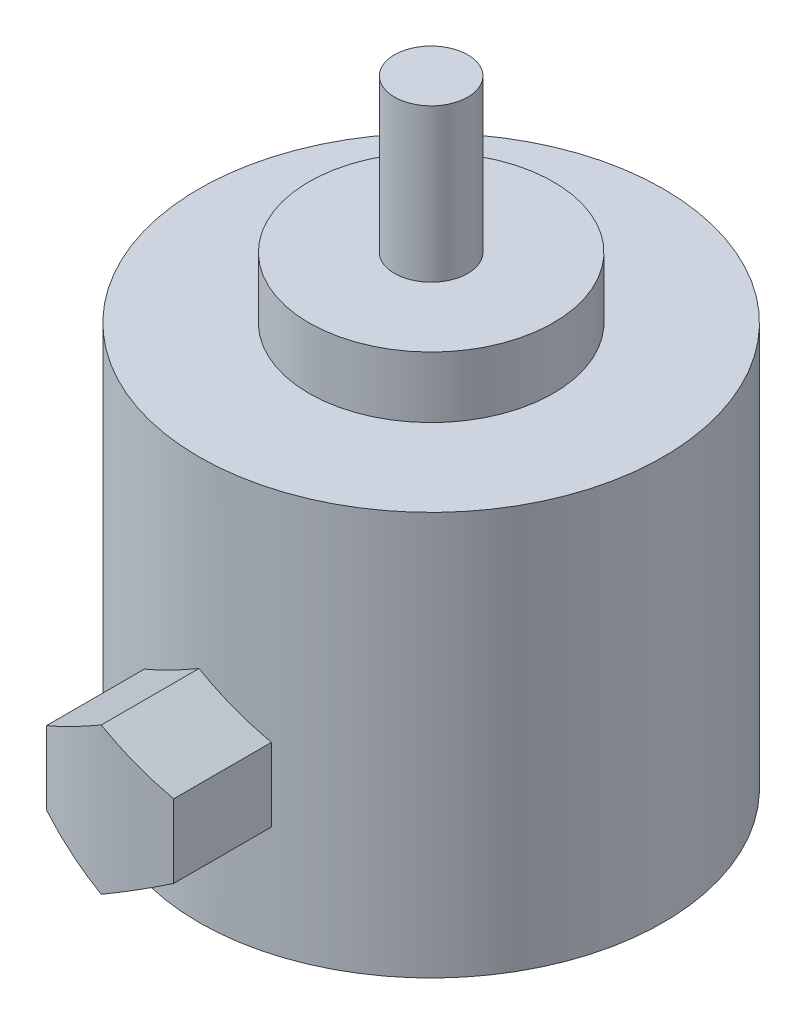
ISO-10303-21;
HEADER;
FILE_DESCRIPTION(('STEP AP214'),'2;1');
FILE_NAME('part.step','',(''),(''),'','','');
FILE_SCHEMA(('AUTOMOTIVE_DESIGN { 1 0 10303 214 1 1 1 1 }'));
ENDSEC;
DATA;
#1=APPLICATION_CONTEXT('core data for automotive mechanical design processes');
#2=APPLICATION_PROTOCOL_DEFINITION('international standard','automotive_design',2000,#1);
#3=PRODUCT_CONTEXT('',#1,'mechanical');
#4=PRODUCT('Part','Part','',(#3));
#5=PRODUCT_RELATED_PRODUCT_CATEGORY('part','',(#4));
#6=PRODUCT_DEFINITION_FORMATION('','',#4);
#7=PRODUCT_DEFINITION_CONTEXT('part definition',#1,'design');
#8=PRODUCT_DEFINITION('design','',#6,#7);
#9=PRODUCT_DEFINITION_SHAPE('','',#8);
#10=(LENGTH_UNIT() NAMED_UNIT(*) SI_UNIT(.MILLI.,.METRE.));
#11=(NAMED_UNIT(*) PLANE_ANGLE_UNIT() SI_UNIT($,.RADIAN.));
#12=(NAMED_UNIT(*) SI_UNIT($,.STERADIAN.) SOLID_ANGLE_UNIT());
#13=UNCERTAINTY_MEASURE_WITH_UNIT(LENGTH_MEASURE(1.E-05),#10,'distance_accuracy_value','');
#14=(GEOMETRIC_REPRESENTATION_CONTEXT(3) GLOBAL_UNCERTAINTY_ASSIGNED_CONTEXT((#13)) GLOBAL_UNIT_ASSIGNED_CONTEXT((#10,
#11,#12)) REPRESENTATION_CONTEXT('',''));
#15=CARTESIAN_POINT('',(0.,0.,0.));
#16=DIRECTION('',(0.,0.,1.));
#17=DIRECTION('',(1.,0.,0.));
#18=AXIS2_PLACEMENT_3D('',#15,#16,#17);
#19=CARTESIAN_POINT('',(0.,33.,0.));
#20=DIRECTION('',(0.,-1.,0.));
#21=DIRECTION('',(0.,0.,-1.));
#22=AXIS2_PLACEMENT_3D('',#19,#20,#21);
#23=CYLINDRICAL_SURFACE('',#22,19.);
#24=CARTESIAN_POINT('',(0.,18.,19.));
#25=CARTESIAN_POINT('',(-1.31767025414648,17.2392427240654,19.));
#26=CARTESIAN_POINT('',(-2.62319740322337,16.4854962731115,18.8180454719326));
#27=CARTESIAN_POINT('',(-3.92825582087346,15.732020444373,18.6361562721164));
#28=CARTESIAN_POINT('',(-5.19615242270662,15.,18.2756668824971));
#29=B_SPLINE_CURVE_WITH_KNOTS('',2,(#24,#25,#26,#27,#28),.UNSPECIFIED.,.F.,.F.,(3,2,3),(0.,0.5,
1.),.UNSPECIFIED.);
#30=CARTESIAN_POINT('',(0.,18.,19.));
#31=VERTEX_POINT('',#30);
#32=CARTESIAN_POINT('',(-5.19615242270663,15.,18.2756668824971));
#33=VERTEX_POINT('',#32);
#34=EDGE_CURVE('E60',#31,#33,#29,.T.);
#35=ORIENTED_EDGE('',*,*,#34,.F.);
#36=CARTESIAN_POINT('',(5.19615242270663,15.,18.2756668824971));
#37=CARTESIAN_POINT('',(3.92871544246554,15.7317550817231,18.6360255921327));
#38=CARTESIAN_POINT('',(2.62319740322338,16.4854962731115,18.8180454719326));
#39=CARTESIAN_POINT('',(1.31814809226343,17.2389668440999,19.));
#40=CARTESIAN_POINT('',(0.,18.,19.));
#41=B_SPLINE_CURVE_WITH_KNOTS('',2,(#36,#37,#38,#39,#40),.UNSPECIFIED.,.F.,.F.,(3,2,3),(0.,0.5,
1.),.UNSPECIFIED.);
#42=CARTESIAN_POINT('',(5.19615242270664,15.,18.2756668824971));
#43=VERTEX_POINT('',#42);
#44=EDGE_CURVE('E244',#43,#31,#41,.T.);
#45=ORIENTED_EDGE('',*,*,#44,.F.);
#46=DIRECTION('',(0.,-1.,0.));
#47=VECTOR('',#46,1.);
#48=CARTESIAN_POINT('',(5.19615242270664,33.,18.2756668824971));
#49=LINE('',#48,#47);
#50=CARTESIAN_POINT('',(5.19615242270664,9.,18.2756668824971));
#51=VERTEX_POINT('',#50);
#52=EDGE_CURVE('E131',#43,#51,#49,.T.);
#53=ORIENTED_EDGE('',*,*,#52,.T.);
#54=CARTESIAN_POINT('',(0.,6.,19.));
#55=CARTESIAN_POINT('',(1.31767025414855,6.76075727593583,19.));
#56=CARTESIAN_POINT('',(2.62319740322338,7.51450372688854,18.8180454719326));
#57=CARTESIAN_POINT('',(3.9282558208755,8.26797955562818,18.6361562721158));
#58=CARTESIAN_POINT('',(5.19615242270664,9.,18.2756668824971));
#59=B_SPLINE_CURVE_WITH_KNOTS('',2,(#54,#55,#56,#57,#58),.UNSPECIFIED.,.F.,.F.,(3,2,3),(0.,0.5,
1.),.UNSPECIFIED.);
#60=CARTESIAN_POINT('',(0.,6.,19.));
#61=VERTEX_POINT('',#60);
#62=EDGE_CURVE('E112',#61,#51,#59,.T.);
#63=ORIENTED_EDGE('',*,*,#62,.F.);
#64=CARTESIAN_POINT('',(-5.19615242270663,9.,18.2756668824971));
#65=CARTESIAN_POINT('',(-3.92871544239619,8.26824491823688,18.6360255921524));
#66=CARTESIAN_POINT('',(-2.62319740322338,7.51450372688854,18.8180454719326));
#67=CARTESIAN_POINT('',(-1.31814809219136,6.76103315585847,19.));
#68=CARTESIAN_POINT('',(0.,6.,19.));
#69=B_SPLINE_CURVE_WITH_KNOTS('',2,(#64,#65,#66,#67,#68),.UNSPECIFIED.,.F.,.F.,(3,2,3),(0.,0.5,
1.),.UNSPECIFIED.);
#70=CARTESIAN_POINT('',(-5.19615242270663,9.,18.2756668824971));
#71=VERTEX_POINT('',#70);
#72=EDGE_CURVE('E173',#71,#61,#69,.T.);
#73=ORIENTED_EDGE('',*,*,#72,.F.);
#74=DIRECTION('',(0.,-1.,0.));
#75=VECTOR('',#74,1.);
#76=CARTESIAN_POINT('',(-5.19615242270663,33.,18.2756668824971));
#77=LINE('',#76,#75);
#78=EDGE_CURVE('E66',#33,#71,#77,.T.);
#79=ORIENTED_EDGE('',*,*,#78,.F.);
#80=EDGE_LOOP('',(#35,#45,#53,#63,#73,#79));
#81=FACE_BOUND('',#80,.T.);
#82=CARTESIAN_POINT('',(0.,33.,0.));
#83=DIRECTION('',(0.,1.,0.));
#84=DIRECTION('',(0.,0.,1.));
#85=AXIS2_PLACEMENT_3D('',#82,#83,#84);
#86=CIRCLE('',#85,19.);
#87=CARTESIAN_POINT('',(0.,33.,19.));
#88=VERTEX_POINT('',#87);
#89=EDGE_CURVE('E281',#88,#88,#86,.T.);
#90=ORIENTED_EDGE('',*,*,#89,.F.);
#91=EDGE_LOOP('',(#90));
#92=FACE_BOUND('',#91,.T.);
#93=CARTESIAN_POINT('',(0.,0.,0.));
#94=DIRECTION('',(0.,1.,0.));
#95=DIRECTION('',(0.,0.,1.));
#96=AXIS2_PLACEMENT_3D('',#93,#94,#95);
#97=CIRCLE('',#96,19.);
#98=CARTESIAN_POINT('',(0.,0.,19.));
#99=VERTEX_POINT('',#98);
#100=EDGE_CURVE('E277',#99,#99,#97,.T.);
#101=ORIENTED_EDGE('',*,*,#100,.T.);
#102=EDGE_LOOP('',(#101));
#103=FACE_BOUND('',#102,.T.);
#104=ADVANCED_FACE('F41',(#81,#92,#103),#23,.T.);
#105=CARTESIAN_POINT('',(0.,33.,0.));
#106=DIRECTION('',(0.,1.,0.));
#107=DIRECTION('',(0.,0.,1.));
#108=AXIS2_PLACEMENT_3D('',#105,#106,#107);
#109=PLANE('',#108);
#110=CARTESIAN_POINT('',(0.,33.,0.));
#111=DIRECTION('',(0.,1.,0.));
#112=DIRECTION('',(0.,0.,1.));
#113=AXIS2_PLACEMENT_3D('',#110,#111,#112);
#114=CIRCLE('',#113,10.);
#115=CARTESIAN_POINT('',(0.,33.,10.));
#116=VERTEX_POINT('',#115);
#117=EDGE_CURVE('E52',#116,#116,#114,.T.);
#118=ORIENTED_EDGE('',*,*,#117,.F.);
#119=EDGE_LOOP('',(#118));
#120=FACE_BOUND('',#119,.T.);
#121=ORIENTED_EDGE('',*,*,#89,.T.);
#122=EDGE_LOOP('',(#121));
#123=FACE_BOUND('',#122,.T.);
#124=ADVANCED_FACE('F321',(#120,#123),#109,.T.);
#125=CARTESIAN_POINT('',(0.,0.,0.));
#126=DIRECTION('',(0.,1.,0.));
#127=DIRECTION('',(0.,0.,1.));
#128=AXIS2_PLACEMENT_3D('',#125,#126,#127);
#129=PLANE('',#128);
#130=ORIENTED_EDGE('',*,*,#100,.F.);
#131=EDGE_LOOP('',(#130));
#132=FACE_BOUND('',#131,.T.);
#133=ADVANCED_FACE('F325',(#132),#129,.F.);
#134=CARTESIAN_POINT('',(0.,38.,0.));
#135=DIRECTION('',(0.,-1.,0.));
#136=DIRECTION('',(0.,0.,-1.));
#137=AXIS2_PLACEMENT_3D('',#134,#135,#136);
#138=CYLINDRICAL_SURFACE('',#137,10.);
#139=CARTESIAN_POINT('',(0.,38.,0.));
#140=DIRECTION('',(0.,1.,0.));
#141=DIRECTION('',(0.,0.,1.));
#142=AXIS2_PLACEMENT_3D('',#139,#140,#141);
#143=CIRCLE('',#142,10.);
#144=CARTESIAN_POINT('',(0.,38.,10.));
#145=VERTEX_POINT('',#144);
#146=EDGE_CURVE('E272',#145,#145,#143,.T.);
#147=ORIENTED_EDGE('',*,*,#146,.F.);
#148=EDGE_LOOP('',(#147));
#149=FACE_BOUND('',#148,.T.);
#150=ORIENTED_EDGE('',*,*,#117,.T.);
#151=EDGE_LOOP('',(#150));
#152=FACE_BOUND('',#151,.T.);
#153=ADVANCED_FACE('F331',(#149,#152),#138,.T.);
#154=CARTESIAN_POINT('',(0.,38.,0.));
#155=DIRECTION('',(0.,1.,0.));
#156=DIRECTION('',(0.,0.,1.));
#157=AXIS2_PLACEMENT_3D('',#154,#155,#156);
#158=PLANE('',#157);
#159=CARTESIAN_POINT('',(0.,38.,0.));
#160=DIRECTION('',(0.,1.,0.));
#161=DIRECTION('',(0.,0.,1.));
#162=AXIS2_PLACEMENT_3D('',#159,#160,#161);
#163=CIRCLE('',#162,3.);
#164=CARTESIAN_POINT('',(0.,38.,3.));
#165=VERTEX_POINT('',#164);
#166=EDGE_CURVE('E11',#165,#165,#163,.T.);
#167=ORIENTED_EDGE('',*,*,#166,.F.);
#168=EDGE_LOOP('',(#167));
#169=FACE_BOUND('',#168,.T.);
#170=ORIENTED_EDGE('',*,*,#146,.T.);
#171=EDGE_LOOP('',(#170));
#172=FACE_BOUND('',#171,.T.);
#173=ADVANCED_FACE('F338',(#169,#172),#158,.T.);
#174=CARTESIAN_POINT('',(0.,50.5,0.));
#175=DIRECTION('',(0.,-1.,0.));
#176=DIRECTION('',(0.,0.,-1.));
#177=AXIS2_PLACEMENT_3D('',#174,#175,#176);
#178=CYLINDRICAL_SURFACE('',#177,3.);
#179=CARTESIAN_POINT('',(0.,50.5,0.));
#180=DIRECTION('',(0.,1.,0.));
#181=DIRECTION('',(0.,0.,1.));
#182=AXIS2_PLACEMENT_3D('',#179,#180,#181);
#183=CIRCLE('',#182,3.);
#184=CARTESIAN_POINT('',(0.,50.5,3.));
#185=VERTEX_POINT('',#184);
#186=EDGE_CURVE('E134',#185,#185,#183,.T.);
#187=ORIENTED_EDGE('',*,*,#186,.F.);
#188=EDGE_LOOP('',(#187));
#189=FACE_BOUND('',#188,.T.);
#190=ORIENTED_EDGE('',*,*,#166,.T.);
#191=EDGE_LOOP('',(#190));
#192=FACE_BOUND('',#191,.T.);
#193=ADVANCED_FACE('F341',(#189,#192),#178,.T.);
#194=CARTESIAN_POINT('',(0.,50.5,0.));
#195=DIRECTION('',(0.,1.,0.));
#196=DIRECTION('',(0.,0.,1.));
#197=AXIS2_PLACEMENT_3D('',#194,#195,#196);
#198=PLANE('',#197);
#199=ORIENTED_EDGE('',*,*,#186,.T.);
#200=EDGE_LOOP('',(#199));
#201=FACE_BOUND('',#200,.T.);
#202=ADVANCED_FACE('F188',(#201),#198,.T.);
#203=CARTESIAN_POINT('',(0.,33.,8.));
#204=DIRECTION('',(0.,-1.,0.));
#205=DIRECTION('',(0.,0.,-1.));
#206=AXIS2_PLACEMENT_3D('',#203,#204,#205);
#207=CYLINDRICAL_SURFACE('',#206,19.);
#208=DIRECTION('',(0.,-1.,0.));
#209=VECTOR('',#208,1.);
#210=CARTESIAN_POINT('',(5.19615242270664,33.,26.2756668824971));
#211=LINE('',#210,#209);
#212=CARTESIAN_POINT('',(5.19615242270664,15.,26.2756668824971));
#213=VERTEX_POINT('',#212);
#214=CARTESIAN_POINT('',(5.19615242270664,9.,26.2756668824971));
#215=VERTEX_POINT('',#214);
#216=EDGE_CURVE('E102',#213,#215,#211,.T.);
#217=ORIENTED_EDGE('',*,*,#216,.F.);
#218=CARTESIAN_POINT('',(5.19615242270663,15.,26.2756668824971));
#219=CARTESIAN_POINT('',(5.12862885958459,15.0389848333847,26.2948652347727));
#220=CARTESIAN_POINT('',(5.06102418601699,15.0780169786119,26.3136821792977));
#221=CARTESIAN_POINT('',(4.92451436171275,15.1568323670652,26.3508650198714));
#222=CARTESIAN_POINT('',(4.85560655459361,15.1966171483103,26.3692179044273));
#223=CARTESIAN_POINT('',(4.71648923030958,15.2769377808235,26.4054334697229));
#224=CARTESIAN_POINT('',(4.64627712622208,15.3174751175582,26.4232829187712));
#225=CARTESIAN_POINT('',(4.50455072024066,15.3993009279824,26.4584517357777));
#226=CARTESIAN_POINT('',(4.43303390960321,15.440590838753,26.4757576508858));
#227=CARTESIAN_POINT('',(4.2886983746289,15.5239218595645,26.5097988187005));
#228=CARTESIAN_POINT('',(4.21587722832226,15.5659643605964,26.5265203967851));
#229=CARTESIAN_POINT('',(4.06893397264344,15.6508005285419,26.5593516404835));
#230=CARTESIAN_POINT('',(3.99480953446151,15.6935955410608,26.5754474096853));
#231=CARTESIAN_POINT('',(3.85292957816229,15.7755101610619,26.6053680074095));
#232=CARTESIAN_POINT('',(3.78518590431214,15.8146227875206,26.6192681763678));
#233=CARTESIAN_POINT('',(3.6479678485054,15.8938476417666,26.6466442371496));
#234=CARTESIAN_POINT('',(3.57849076736368,15.9339614364654,26.6601020713283));
#235=CARTESIAN_POINT('',(3.43780418437584,16.015188583035,26.6865391146336));
#236=CARTESIAN_POINT('',(3.36659207058253,16.0563034269615,26.69949983995));
#237=CARTESIAN_POINT('',(3.22243472485641,16.1395327843132,26.724886976792));
#238=CARTESIAN_POINT('',(3.14948698530837,16.1816487236673,26.7372944769544));
#239=CARTESIAN_POINT('',(3.00185873566901,16.2668802866835,26.7615181514312));
#240=CARTESIAN_POINT('',(2.92717583853859,16.309997272435,26.7733149859524));
#241=CARTESIAN_POINT('',(2.77607880188176,16.3972311499375,26.7962589964823));
#242=CARTESIAN_POINT('',(2.69966241368164,16.4413493486592,26.8073864035236));
#243=CARTESIAN_POINT('',(2.55297623669258,16.5260383264664,26.8278341610771));
#244=CARTESIAN_POINT('',(2.48271406432301,16.5666046058182,26.8372278743572));
#245=CARTESIAN_POINT('',(2.33978377258606,16.6491258445978,26.8555236851809));
#246=CARTESIAN_POINT('',(2.26711309127337,16.6910822696708,26.8643991713521));
#247=CARTESIAN_POINT('',(2.11936561870511,16.7763839773837,26.8815782307488));
#248=CARTESIAN_POINT('',(2.04428642541902,16.8197306368836,26.8898543236878));
#249=CARTESIAN_POINT('',(1.89962886288369,16.9032488064091,26.9049279030037));
#250=CARTESIAN_POINT('',(1.83005547546755,16.943417386177,26.9117895271912));
#251=CARTESIAN_POINT('',(1.68759481779846,17.0256675015648,26.9250463227175));
#252=CARTESIAN_POINT('',(1.61470496342336,17.0677505135577,26.931404592783));
#253=CARTESIAN_POINT('',(1.46561099154766,17.1538295083017,26.9435431211012));
#254=CARTESIAN_POINT('',(1.38940450459008,17.1978268357253,26.9492847885961));
#255=CARTESIAN_POINT('',(1.24567324617153,17.2808103041393,26.9592425080131));
#256=CARTESIAN_POINT('',(1.17815356627787,17.3197933742711,26.9635579697093));
#257=CARTESIAN_POINT('',(1.03765931722977,17.4009085137794,26.971784427261));
#258=CARTESIAN_POINT('',(0.964682080515094,17.4430420889141,26.9756351206566));
#259=CARTESIAN_POINT('',(0.813271763412981,17.5304578744894,26.9827487966753));
#260=CARTESIAN_POINT('',(0.734836340694596,17.5757413400158,26.9859468209424));
#261=CARTESIAN_POINT('',(0.599687652437891,17.653770679029,26.9906185721026));
#262=CARTESIAN_POINT('',(0.542979904212539,17.6865124369259,26.9923245387024));
#263=CARTESIAN_POINT('',(0.413342357208231,17.7613606135231,26.9956434336557));
#264=CARTESIAN_POINT('',(0.340409128019849,17.803468561083,26.9970903694766));
#265=CARTESIAN_POINT('',(0.178318771633867,17.8970501752918,26.9993724182558));
#266=CARTESIAN_POINT('',(0.089159308717131,17.9485249377529,27.0000000135914));
#267=CARTESIAN_POINT('',(0.,18.,27.));
#268=B_SPLINE_CURVE_WITH_KNOTS('',3,(#218,#219,#220,#221,#222,#223,#224,#225,#226,#227,#228,
#229,#230,#231,#232,#233,#234,#235,#236,#237,#238,#239,#240,#241,#242,#243,#244,#245,#246,#247,
#248,#249,#250,#251,#252,#253,#254,#255,#256,#257,#258,#259,#260,#261,#262,#263,#264,#265,#266,
#267),.UNSPECIFIED.,.F.,.F.,(4,2,2,2,2,2,2,2,2,2,2,2,2,2,2,2,2,2,2,2,2,2,2,2,4),(0.,
0.240894087627717,0.485862490256823,0.734905604360248,0.988023807170361,1.24521745789517,
1.50648689884003,1.74483174878858,1.98886811477451,2.23859620337806,2.49401620710533,
2.7551283056091,3.02193266677969,3.26695079160072,3.52008936485443,3.78134847318646,
4.02323216633852,4.27644532471976,4.54098798294824,4.77523863976937,5.02829906245106,
5.30016923292449,5.4966778172742,5.74935886592767,6.05821206996152),.UNSPECIFIED.);
#269=CARTESIAN_POINT('',(0.,18.,27.));
#270=VERTEX_POINT('',#269);
#271=EDGE_CURVE('E245',#213,#270,#268,.T.);
#272=ORIENTED_EDGE('',*,*,#271,.T.);
#273=CARTESIAN_POINT('',(0.,18.,27.));
#274=CARTESIAN_POINT('',(-0.0891507980637317,17.9485298487177,27.0000000136199));
#275=CARTESIAN_POINT('',(-0.178301752297458,17.8970600006609,26.9993725380596));
#276=CARTESIAN_POINT('',(-0.340383603895577,17.8034833007672,26.9970908268226));
#277=CARTESIAN_POINT('',(-0.413316835380689,17.7613753538456,26.9956439889854));
#278=CARTESIAN_POINT('',(-0.542962892783233,17.6865222628232,26.9923250504639));
#279=CARTESIAN_POINT('',(-0.599679147752742,17.6537755913973,26.9906188660846));
#280=CARTESIAN_POINT('',(-0.734824035773418,17.575748441457,26.9859472462978));
#281=CARTESIAN_POINT('',(-0.813247156719919,17.5304720743052,26.9827497999717));
#282=CARTESIAN_POINT('',(-0.964645187424007,17.4430633880452,26.9756369961744));
#283=CARTESIAN_POINT('',(-1.03762243351225,17.4009298161842,26.9717864445609));
#284=CARTESIAN_POINT('',(-1.1781289894118,17.3198075740678,26.9635595405255));
#285=CARTESIAN_POINT('',(-1.24566096131286,17.280817402169,26.9592433591049));
#286=CARTESIAN_POINT('',(-1.38939190171941,17.1978341059759,26.9492856617298));
#287=CARTESIAN_POINT('',(-1.46558579307126,17.1538440436895,26.9435450196722));
#288=CARTESIAN_POINT('',(-1.61466719501648,17.067772314981,26.9314078140782));
#289=CARTESIAN_POINT('',(-1.68755706524773,17.0256893085184,26.9250496891464));
#290=CARTESIAN_POINT('',(-1.83003032765434,16.9434319215543,26.9117920073973));
#291=CARTESIAN_POINT('',(-1.89961629458087,16.9032560710523,26.9049292126396));
#292=CARTESIAN_POINT('',(-2.04427377150714,16.8197379336444,26.8898556422526));
#293=CARTESIAN_POINT('',(-2.11934032216695,16.7763985636828,26.881581019264));
#294=CARTESIAN_POINT('',(-2.26707518775113,16.6911041458689,26.864403726505));
#295=CARTESIAN_POINT('',(-2.3397458910382,16.6491477280596,26.8555283858388));
#296=CARTESIAN_POINT('',(-2.48268883931853,16.5666191925806,26.8372312468524));
#297=CARTESIAN_POINT('',(-2.55296363294646,16.5260456177934,26.8278359180085));
#298=CARTESIAN_POINT('',(-2.69965459795262,16.4413538451845,26.8073874930264));
#299=CARTESIAN_POINT('',(-2.77606317705542,16.3972401316779,26.7962612717344));
#300=CARTESIAN_POINT('',(-2.92714775112697,16.3100134346343,26.773319346279));
#301=CARTESIAN_POINT('',(-3.00182598997118,16.266899146244,26.761523371644));
#302=CARTESIAN_POINT('',(-3.14944805625494,16.1816711771636,26.737301014136));
#303=CARTESIAN_POINT('',(-3.22239426595762,16.1395561369312,26.7248939332268));
#304=CARTESIAN_POINT('',(-3.36655166830388,16.0563267789715,26.6995071198979));
#305=CARTESIAN_POINT('',(-3.43776536372197,16.0152110380536,26.6865462626344));
#306=CARTESIAN_POINT('',(-3.57845820719406,15.9339802999986,26.6601083333973));
#307=CARTESIAN_POINT('',(-3.64793996236596,15.8938638137659,26.6466497106415));
#308=CARTESIAN_POINT('',(-3.78517043766818,15.8146317704977,26.6192713499661));
#309=CARTESIAN_POINT('',(-3.85292185235676,15.7755146499939,26.605369636676));
#310=CARTESIAN_POINT('',(-3.99480601521829,15.6935975417467,26.5754481518505));
#311=CARTESIAN_POINT('',(-4.06892693890623,15.6508045226132,26.5593531678625));
#312=CARTESIAN_POINT('',(-4.21586459255818,15.5659715478066,26.5265232634302));
#313=CARTESIAN_POINT('',(-4.28868364822043,15.5239302478637,26.5098022220706));
#314=CARTESIAN_POINT('',(-4.43301641309516,15.440600826628,26.4757618460873));
#315=CARTESIAN_POINT('',(-4.50453254120692,15.3993113159177,26.4584561692692));
#316=CARTESIAN_POINT('',(-4.64625898300169,15.3174855052135,26.4232874972282));
#317=CARTESIAN_POINT('',(-4.71647180232071,15.2769477697825,26.405437938567));
#318=CARTESIAN_POINT('',(-4.85559194523671,15.1966255388262,26.3692217745417));
#319=CARTESIAN_POINT('',(-4.92450185265901,15.156839559602,26.3508683850994));
#320=CARTESIAN_POINT('',(-5.06101725264901,15.0780209739308,26.3136841091341));
#321=CARTESIAN_POINT('',(-5.12862539852989,15.0389868313601,26.2948662188482));
#322=CARTESIAN_POINT('',(-5.19615242270661,15.,26.2756668824971));
#323=B_SPLINE_CURVE_WITH_KNOTS('',3,(#273,#274,#275,#276,#277,#278,#279,#280,#281,#282,#283,
#284,#285,#286,#287,#288,#289,#290,#291,#292,#293,#294,#295,#296,#297,#298,#299,#300,#301,#302,
#303,#304,#305,#306,#307,#308,#309,#310,#311,#312,#313,#314,#315,#316,#317,#318,#319,#320,#321,
#322),.UNSPECIFIED.,.F.,.F.,(4,2,2,2,2,2,2,2,2,2,2,2,2,2,2,2,2,2,2,2,2,2,2,2,4),(0.,
0.308823726873777,0.561504775527237,0.758042837362377,1.02987036761863,1.28293079030032,
1.51722408749491,1.78172301876809,2.03493617714933,2.27686359735148,2.53807870671198,
2.79121727996569,3.03627940382461,3.30305651760871,3.56415226765209,3.81956682188647,
4.06930035998507,4.31335307444914,4.55172517182421,4.81298226604267,5.07016850867665,
5.32328424210763,5.5723298256026,5.81730563643317,6.05821207108897),.UNSPECIFIED.);
#324=CARTESIAN_POINT('',(-5.19615242270662,15.,26.2756668824971));
#325=VERTEX_POINT('',#324);
#326=EDGE_CURVE('E214',#270,#325,#323,.T.);
#327=ORIENTED_EDGE('',*,*,#326,.T.);
#328=DIRECTION('',(0.,-1.,0.));
#329=VECTOR('',#328,1.);
#330=CARTESIAN_POINT('',(-5.19615242270663,33.,26.2756668824971));
#331=LINE('',#330,#329);
#332=CARTESIAN_POINT('',(-5.19615242270663,9.,26.2756668824971));
#333=VERTEX_POINT('',#332);
#334=EDGE_CURVE('E448',#325,#333,#331,.T.);
#335=ORIENTED_EDGE('',*,*,#334,.T.);
#336=CARTESIAN_POINT('',(-5.19615242270662,8.99999999999999,26.2756668824971));
#337=CARTESIAN_POINT('',(-5.12862885968057,8.96101516667071,26.2948652347454));
#338=CARTESIAN_POINT('',(-5.06102418620929,8.92198302149896,26.3136821792442));
#339=CARTESIAN_POINT('',(-4.92451436205971,8.84316763313432,26.350865019778));
#340=CARTESIAN_POINT('',(-4.85560655499883,8.80338285192245,26.3692179043199));
#341=CARTESIAN_POINT('',(-4.71648923079298,8.72306221945354,26.405433469599));
#342=CARTESIAN_POINT('',(-4.64627712672529,8.68252488272988,26.4232829186442));
#343=CARTESIAN_POINT('',(-4.50455072074488,8.60069907230574,26.4584517356547));
#344=CARTESIAN_POINT('',(-4.43303391008851,8.55940916152399,26.4757576507694));
#345=CARTESIAN_POINT('',(-4.28869837503733,8.47607814066816,26.5097988186061));
#346=CARTESIAN_POINT('',(-4.21587722867265,8.43403563960304,26.5265203967056));
#347=CARTESIAN_POINT('',(-4.06893397283859,8.3491994715688,26.5593516404411));
#348=CARTESIAN_POINT('',(-3.99480953455939,8.30640445899418,26.5754474096647));
#349=CARTESIAN_POINT('',(-3.85292957717299,8.22448983836831,26.6053680076181));
#350=CARTESIAN_POINT('',(-3.78518590233148,8.18537721133942,26.6192681767743));
#351=CARTESIAN_POINT('',(-3.64796784493439,8.10615235618104,26.6466442378505));
#352=CARTESIAN_POINT('',(-3.57849076319431,8.06603856114031,26.6601020721302));
#353=CARTESIAN_POINT('',(-3.43780417940493,7.98481141411461,26.6865391155489));
#354=CARTESIAN_POINT('',(-3.36659206540909,7.9436965700743,26.6994998408822));
#355=CARTESIAN_POINT('',(-3.22243471967574,7.86046721272243,26.7248869776828));
#356=CARTESIAN_POINT('',(-3.14948698032362,7.81835127348244,26.7372944777914));
#357=CARTESIAN_POINT('',(-3.00185873147586,7.73311971092271,26.7615181520996));
#358=CARTESIAN_POINT('',(-2.92717583494173,7.69000272551396,26.7733149865107));
#359=CARTESIAN_POINT('',(-2.77607879988101,7.60276884892243,26.7962589967737));
#360=CARTESIAN_POINT('',(-2.69966241268135,7.55865065076915,26.807386403663));
#361=CARTESIAN_POINT('',(-2.55297623272205,7.47396167123584,26.8278341616306));
#362=CARTESIAN_POINT('',(-2.48271405637609,7.43339538958557,26.8372278754197));
#363=CARTESIAN_POINT('',(-2.33978376065169,7.35087414850707,26.8555236866618));
#364=CARTESIAN_POINT('',(-2.26711307933212,7.30891772343622,26.8643991727871));
#365=CARTESIAN_POINT('',(-2.11936561073558,7.2236160180203,26.8815782316273));
#366=CARTESIAN_POINT('',(-2.04428642143241,7.18026936081743,26.8898543241032));
#367=CARTESIAN_POINT('',(-1.89962885957805,7.09675119167993,26.9049279033482));
#368=CARTESIAN_POINT('',(-1.83005546885345,7.0565826099992,26.9117895278435));
#369=CARTESIAN_POINT('',(-1.68759480786931,6.97433249269831,26.9250463236029));
#370=CARTESIAN_POINT('',(-1.61470495349008,6.93224948070677,26.9314045936302));
#371=CARTESIAN_POINT('',(-1.46561098492017,6.84617048787463,26.9435431216005));
#372=CARTESIAN_POINT('',(-1.38940450127507,6.8021731623627,26.9492847888257));
#373=CARTESIAN_POINT('',(-1.2456732465926,6.71918969610212,26.9592425079839));
#374=CARTESIAN_POINT('',(-1.17815356712064,6.68020662621121,26.9635579696554));
#375=CARTESIAN_POINT('',(-1.03765931849477,6.59909148694373,26.9717844271918));
#376=CARTESIAN_POINT('',(-0.964682081780364,6.55695791180897,26.9756351205923));
#377=CARTESIAN_POINT('',(-0.813271764256706,6.46954212599296,26.9827487966409));
#378=CARTESIAN_POINT('',(-0.734836341116217,6.42425866022586,26.9859468209279));
#379=CARTESIAN_POINT('',(-0.599687656222732,6.34622932315745,26.9906185719718));
#380=CARTESIAN_POINT('',(-0.542979911783347,6.31348756744719,26.9923245384747));
#381=CARTESIAN_POINT('',(-0.413342368566633,6.23863939303689,26.9956434334085));
#382=CARTESIAN_POINT('',(-0.340409139379243,6.19653144547673,26.997090369273));
#383=CARTESIAN_POINT('',(-0.178318779208186,6.10294982908096,26.9993724182025));
#384=CARTESIAN_POINT('',(-0.089159312504666,6.05147506443287,27.0000000135914));
#385=CARTESIAN_POINT('',(0.,6.,27.));
#386=B_SPLINE_CURVE_WITH_KNOTS('',3,(#336,#337,#338,#339,#340,#341,#342,#343,#344,#345,#346,
#347,#348,#349,#350,#351,#352,#353,#354,#355,#356,#357,#358,#359,#360,#361,#362,#363,#364,#365,
#366,#367,#368,#369,#370,#371,#372,#373,#374,#375,#376,#377,#378,#379,#380,#381,#382,#383,#384,
#385),.UNSPECIFIED.,.F.,.F.,(4,2,2,2,2,2,2,2,2,2,2,2,2,2,2,2,2,2,2,2,2,2,2,2,4),(0.,
0.240894087285244,0.485862489708867,0.734905603743816,0.988023806622417,1.24521745755269,
1.50648689884002,1.74483175227018,1.98886812034505,2.23859620964493,2.49401621267589,
2.75512830909072,3.02193266677976,3.26695080546288,3.5200893787166,3.78134847318654,
4.02323217783984,4.27644533622109,4.54098798294836,4.77523863831079,5.02829906099249,
5.30016923292459,5.4966778041555,5.74935885280898,6.05821206996147),.UNSPECIFIED.);
#387=CARTESIAN_POINT('',(0.,6.,27.));
#388=VERTEX_POINT('',#387);
#389=EDGE_CURVE('E105',#333,#388,#386,.T.);
#390=ORIENTED_EDGE('',*,*,#389,.T.);
#391=CARTESIAN_POINT('',(0.,6.,27.));
#392=CARTESIAN_POINT('',(0.0891507904921104,6.0514701469127,27.0000000136199));
#393=CARTESIAN_POINT('',(0.178301737155666,6.10293999059747,26.9993725381662));
#394=CARTESIAN_POINT('',(0.340383581187032,6.19651668611925,26.9970908272295));
#395=CARTESIAN_POINT('',(0.413316812674132,6.23862463304044,26.9956439894794));
#396=CARTESIAN_POINT('',(0.542962877648493,6.31347772843463,26.9923250509192));
#397=CARTESIAN_POINT('',(0.59967914018655,6.34622440423165,26.9906188663461));
#398=CARTESIAN_POINT('',(0.734824037278037,6.42425155941538,26.9859472462458));
#399=CARTESIAN_POINT('',(0.813247159727294,6.46952792744161,26.9827497998491));
#400=CARTESIAN_POINT('',(0.964645191932477,6.55693661457579,26.9756369959452));
#401=CARTESIAN_POINT('',(1.03762243801957,6.59907018643722,26.9717864443144));
#402=CARTESIAN_POINT('',(1.17812899241534,6.68019242767931,26.9635595403335));
#403=CARTESIAN_POINT('',(1.24566096281422,6.71918259870431,26.9592433590009));
#404=CARTESIAN_POINT('',(1.38939190476758,6.80216589577659,26.9492856615187));
#405=CARTESIAN_POINT('',(1.46558579916571,6.84615595981448,26.9435450192131));
#406=CARTESIAN_POINT('',(1.61466720415107,6.93222769027452,26.9314078132991));
#407=CARTESIAN_POINT('',(1.68755707437865,6.9743106967382,26.9250496883322));
#408=CARTESIAN_POINT('',(1.83003033373649,7.05656808194973,26.9117920067975));
#409=CARTESIAN_POINT('',(1.89961629762034,7.09674393069943,26.9049292123228));
#410=CARTESIAN_POINT('',(2.04427377142983,7.1802620663143,26.8898556422607));
#411=CARTESIAN_POINT('',(2.1193403220131,7.22360143623344,26.881581019281));
#412=CARTESIAN_POINT('',(2.26707518752087,7.30889585400501,26.8644037265326));
#413=CARTESIAN_POINT('',(2.33974589080795,7.3508522718145,26.8555283858674));
#414=CARTESIAN_POINT('',(2.4826888391652,7.43338080733548,26.8372312468729));
#415=CARTESIAN_POINT('',(2.55296363286992,7.47395438216458,26.8278359180192));
#416=CARTESIAN_POINT('',(2.69965459898438,7.55864615540887,26.8073874928826));
#417=CARTESIAN_POINT('',(2.77606317911744,7.60275986950826,26.7962612714342));
#418=CARTESIAN_POINT('',(2.92714775483343,7.68998656750063,26.7733193457036));
#419=CARTESIAN_POINT('',(3.00182599429244,7.73310085624709,26.7615233709551));
#420=CARTESIAN_POINT('',(3.14944806139224,7.81832882580211,26.7373010132733));
#421=CARTESIAN_POINT('',(3.22239427129679,7.86044386615328,26.7248939323088));
#422=CARTESIAN_POINT('',(3.36655167363557,7.94367322411291,26.6995071189372));
#423=CARTESIAN_POINT('',(3.43776536884495,7.98478896491227,26.6865462616912));
#424=CARTESIAN_POINT('',(3.57845821149087,8.06601970249298,26.660108332571));
#425=CARTESIAN_POINT('',(3.64793996604596,8.10613618837012,26.6466497099192));
#426=CARTESIAN_POINT('',(3.78517043970924,8.18536823068881,26.6192713495473));
#427=CARTESIAN_POINT('',(3.85292185337632,8.22448535059904,26.6053696364609));
#428=CARTESIAN_POINT('',(3.99480601574054,8.3064024585501,26.5754481517404));
#429=CARTESIAN_POINT('',(4.06892693994995,8.34919547797948,26.5593531676359));
#430=CARTESIAN_POINT('',(4.21586459443312,8.43402845325989,26.5265232630048));
#431=CARTESIAN_POINT('',(4.28868365040559,8.47606975338099,26.5098022215656));
#432=CARTESIAN_POINT('',(4.43301641569136,8.55939917485402,26.4757618454648));
#433=CARTESIAN_POINT('',(4.50453254390439,8.60068868562366,26.4584561686114));
#434=CARTESIAN_POINT('',(4.64625898569386,8.68251449632785,26.4232874965488));
#435=CARTESIAN_POINT('',(4.71647180490674,8.7230522316997,26.4054379379039));
#436=CARTESIAN_POINT('',(4.8555919474045,8.80337446241885,26.3692217739674));
#437=CARTESIAN_POINT('',(4.92450185451516,8.84316044146525,26.3508683846001));
#438=CARTESIAN_POINT('',(5.06101725367782,8.92197902666207,26.3136841088477));
#439=CARTESIAN_POINT('',(5.12862539904348,8.96101316893635,26.2948662187021));
#440=CARTESIAN_POINT('',(5.19615242270663,9.,26.2756668824971));
#441=B_SPLINE_CURVE_WITH_KNOTS('',3,(#391,#392,#393,#394,#395,#396,#397,#398,#399,#400,#401,
#402,#403,#404,#405,#406,#407,#408,#409,#410,#411,#412,#413,#414,#415,#416,#417,#418,#419,#420,
#421,#422,#423,#424,#425,#426,#427,#428,#429,#430,#431,#432,#433,#434,#435,#436,#437,#438,#439,
#440),.UNSPECIFIED.,.F.,.F.,(4,2,2,2,2,2,2,2,2,2,2,2,2,2,2,2,2,2,2,2,2,2,2,2,4),(0.,
0.308823700648327,0.561504749301799,0.758042837362668,1.02987037283879,1.28293079552048,
1.51722408749519,1.78172302933544,2.03493618771668,2.27686359735172,2.53807870644832,
2.79121727970203,3.03627940382487,3.30305652120546,3.56415227340671,3.81956682836039,
4.06930036573969,4.31335307804589,4.55172517182447,4.81298226787498,5.07016851160818,
5.32328424540558,5.57232982853413,5.81730563826546,6.05821207108917),.UNSPECIFIED.);
#442=EDGE_CURVE('E97',#388,#215,#441,.T.);
#443=ORIENTED_EDGE('',*,*,#442,.T.);
#444=EDGE_LOOP('',(#217,#272,#327,#335,#390,#443));
#445=FACE_BOUND('',#444,.T.);
#446=ADVANCED_FACE('F100',(#445),#207,.T.);
#447=CARTESIAN_POINT('',(0.,18.,19.));
#448=DIRECTION('',(0.5,0.866025403784438,0.));
#449=DIRECTION('',(-0.866025403784438,0.5,0.));
#450=AXIS2_PLACEMENT_3D('',#447,#448,#449);
#451=PLANE('',#450);
#452=ORIENTED_EDGE('',*,*,#271,.F.);
#453=DIRECTION('',(0.,0.,1.));
#454=VECTOR('',#453,1.);
#455=CARTESIAN_POINT('',(5.19615242270664,15.,18.2756668824971));
#456=LINE('',#455,#454);
#457=EDGE_CURVE('E128',#43,#213,#456,.T.);
#458=ORIENTED_EDGE('',*,*,#457,.F.);
#459=ORIENTED_EDGE('',*,*,#44,.T.);
#460=DIRECTION('',(0.,0.,1.));
#461=VECTOR('',#460,1.);
#462=CARTESIAN_POINT('',(0.,18.,19.));
#463=LINE('',#462,#461);
#464=EDGE_CURVE('E205',#31,#270,#463,.T.);
#465=ORIENTED_EDGE('',*,*,#464,.T.);
#466=EDGE_LOOP('',(#452,#458,#459,#465));
#467=FACE_BOUND('',#466,.T.);
#468=ADVANCED_FACE('F187',(#467),#451,.T.);
#469=CARTESIAN_POINT('',(-5.19615242270663,15.,18.2756668824971));
#470=DIRECTION('',(-0.5,0.866025403784439,0.));
#471=DIRECTION('',(-0.866025403784439,-0.5,0.));
#472=AXIS2_PLACEMENT_3D('',#469,#470,#471);
#473=PLANE('',#472);
#474=ORIENTED_EDGE('',*,*,#326,.F.);
#475=ORIENTED_EDGE('',*,*,#464,.F.);
#476=ORIENTED_EDGE('',*,*,#34,.T.);
#477=DIRECTION('',(0.,0.,1.));
#478=VECTOR('',#477,1.);
#479=CARTESIAN_POINT('',(-5.19615242270663,15.,18.2756668824971));
#480=LINE('',#479,#478);
#481=EDGE_CURVE('E449',#33,#325,#480,.T.);
#482=ORIENTED_EDGE('',*,*,#481,.T.);
#483=EDGE_LOOP('',(#474,#475,#476,#482));
#484=FACE_BOUND('',#483,.T.);
#485=ADVANCED_FACE('F220',(#484),#473,.T.);
#486=CARTESIAN_POINT('',(-5.19615242270663,33.,18.2756668824971));
#487=DIRECTION('',(-1.,0.,0.));
#488=DIRECTION('',(0.,0.,1.));
#489=AXIS2_PLACEMENT_3D('',#486,#487,#488);
#490=PLANE('',#489);
#491=ORIENTED_EDGE('',*,*,#334,.F.);
#492=ORIENTED_EDGE('',*,*,#481,.F.);
#493=ORIENTED_EDGE('',*,*,#78,.T.);
#494=DIRECTION('',(0.,0.,1.));
#495=VECTOR('',#494,1.);
#496=CARTESIAN_POINT('',(-5.19615242270663,9.,18.2756668824971));
#497=LINE('',#496,#495);
#498=EDGE_CURVE('E146',#71,#333,#497,.T.);
#499=ORIENTED_EDGE('',*,*,#498,.T.);
#500=EDGE_LOOP('',(#491,#492,#493,#499));
#501=FACE_BOUND('',#500,.T.);
#502=ADVANCED_FACE('F229',(#501),#490,.T.);
#503=CARTESIAN_POINT('',(0.,6.,19.));
#504=DIRECTION('',(-0.5,-0.866025403784438,0.));
#505=DIRECTION('',(0.866025403784439,-0.5,0.));
#506=AXIS2_PLACEMENT_3D('',#503,#504,#505);
#507=PLANE('',#506);
#508=ORIENTED_EDGE('',*,*,#389,.F.);
#509=ORIENTED_EDGE('',*,*,#498,.F.);
#510=ORIENTED_EDGE('',*,*,#72,.T.);
#511=DIRECTION('',(0.,0.,1.));
#512=VECTOR('',#511,1.);
#513=CARTESIAN_POINT('',(0.,6.,19.));
#514=LINE('',#513,#512);
#515=EDGE_CURVE('E113',#61,#388,#514,.T.);
#516=ORIENTED_EDGE('',*,*,#515,.T.);
#517=EDGE_LOOP('',(#508,#509,#510,#516));
#518=FACE_BOUND('',#517,.T.);
#519=ADVANCED_FACE('F157',(#518),#507,.T.);
#520=CARTESIAN_POINT('',(5.19615242270664,9.,18.2756668824971));
#521=DIRECTION('',(0.5,-0.866025403784439,0.));
#522=DIRECTION('',(0.866025403784439,0.5,0.));
#523=AXIS2_PLACEMENT_3D('',#520,#521,#522);
#524=PLANE('',#523);
#525=ORIENTED_EDGE('',*,*,#442,.F.);
#526=ORIENTED_EDGE('',*,*,#515,.F.);
#527=ORIENTED_EDGE('',*,*,#62,.T.);
#528=DIRECTION('',(0.,0.,1.));
#529=VECTOR('',#528,1.);
#530=CARTESIAN_POINT('',(5.19615242270664,9.,18.2756668824971));
#531=LINE('',#530,#529);
#532=EDGE_CURVE('E119',#51,#215,#531,.T.);
#533=ORIENTED_EDGE('',*,*,#532,.T.);
#534=EDGE_LOOP('',(#525,#526,#527,#533));
#535=FACE_BOUND('',#534,.T.);
#536=ADVANCED_FACE('F120',(#535),#524,.T.);
#537=CARTESIAN_POINT('',(5.19615242270664,33.,18.2756668824971));
#538=DIRECTION('',(-1.,0.,0.));
#539=DIRECTION('',(0.,0.,1.));
#540=AXIS2_PLACEMENT_3D('',#537,#538,#539);
#541=PLANE('',#540);
#542=ORIENTED_EDGE('',*,*,#216,.T.);
#543=ORIENTED_EDGE('',*,*,#532,.F.);
#544=ORIENTED_EDGE('',*,*,#52,.F.);
#545=ORIENTED_EDGE('',*,*,#457,.T.);
#546=EDGE_LOOP('',(#542,#543,#544,#545));
#547=FACE_BOUND('',#546,.T.);
#548=ADVANCED_FACE('F126',(#547),#541,.F.);
#549=CLOSED_SHELL('',(#104,#124,#133,#153,#173,#193,#202,#446,#468,#485,#502,#519,#536,#548));
#550=MANIFOLD_SOLID_BREP('B2',#549);
#551=ADVANCED_BREP_SHAPE_REPRESENTATION('',(#18,#550),#14);
#552=SHAPE_DEFINITION_REPRESENTATION(#9,#551);
ENDSEC;
END-ISO-10303-21;
